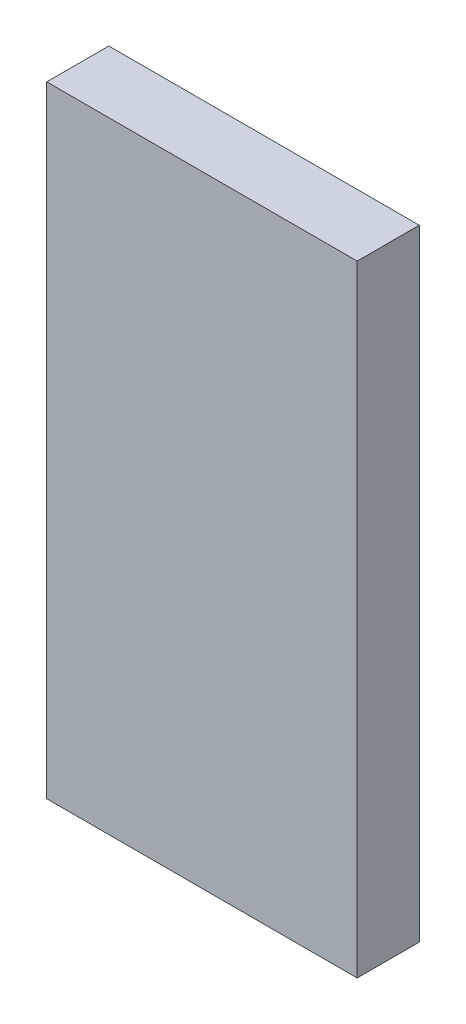
ISO-10303-21;
HEADER;
FILE_DESCRIPTION(('STEP AP214'),'2;1');
FILE_NAME('part.step','',(''),(''),'','','');
FILE_SCHEMA(('AUTOMOTIVE_DESIGN { 1 0 10303 214 1 1 1 1 }'));
ENDSEC;
DATA;
#1=APPLICATION_CONTEXT('core data for automotive mechanical design processes');
#2=APPLICATION_PROTOCOL_DEFINITION('international standard','automotive_design',2000,#1);
#3=PRODUCT_CONTEXT('',#1,'mechanical');
#4=PRODUCT('Part','Part','',(#3));
#5=PRODUCT_RELATED_PRODUCT_CATEGORY('part','',(#4));
#6=PRODUCT_DEFINITION_FORMATION('','',#4);
#7=PRODUCT_DEFINITION_CONTEXT('part definition',#1,'design');
#8=PRODUCT_DEFINITION('design','',#6,#7);
#9=PRODUCT_DEFINITION_SHAPE('','',#8);
#10=(LENGTH_UNIT() NAMED_UNIT(*) SI_UNIT(.MILLI.,.METRE.));
#11=(NAMED_UNIT(*) PLANE_ANGLE_UNIT() SI_UNIT($,.RADIAN.));
#12=(NAMED_UNIT(*) SI_UNIT($,.STERADIAN.) SOLID_ANGLE_UNIT());
#13=UNCERTAINTY_MEASURE_WITH_UNIT(LENGTH_MEASURE(1.E-05),#10,'distance_accuracy_value','');
#14=(GEOMETRIC_REPRESENTATION_CONTEXT(3) GLOBAL_UNCERTAINTY_ASSIGNED_CONTEXT((#13)) GLOBAL_UNIT_ASSIGNED_CONTEXT((#10,
#11,#12)) REPRESENTATION_CONTEXT('',''));
#15=CARTESIAN_POINT('',(0.,0.,0.));
#16=DIRECTION('',(0.,0.,1.));
#17=DIRECTION('',(1.,0.,0.));
#18=AXIS2_PLACEMENT_3D('',#15,#16,#17);
#19=CARTESIAN_POINT('',(30.,-60.,12.));
#20=DIRECTION('',(-1.,0.,0.));
#21=DIRECTION('',(0.,0.,1.));
#22=AXIS2_PLACEMENT_3D('',#19,#20,#21);
#23=PLANE('',#22);
#24=DIRECTION('',(0.,1.,0.));
#25=VECTOR('',#24,1.);
#26=CARTESIAN_POINT('',(30.,-60.,0.));
#27=LINE('',#26,#25);
#28=CARTESIAN_POINT('',(30.,-60.,0.));
#29=VERTEX_POINT('',#28);
#30=CARTESIAN_POINT('',(30.,60.,0.));
#31=VERTEX_POINT('',#30);
#32=EDGE_CURVE('E99',#29,#31,#27,.T.);
#33=ORIENTED_EDGE('',*,*,#32,.T.);
#34=DIRECTION('',(0.,0.,-1.));
#35=VECTOR('',#34,1.);
#36=CARTESIAN_POINT('',(30.,60.,12.));
#37=LINE('',#36,#35);
#38=CARTESIAN_POINT('',(30.,60.,12.));
#39=VERTEX_POINT('',#38);
#40=EDGE_CURVE('E11',#39,#31,#37,.T.);
#41=ORIENTED_EDGE('',*,*,#40,.F.);
#42=DIRECTION('',(0.,1.,0.));
#43=VECTOR('',#42,1.);
#44=CARTESIAN_POINT('',(30.,-60.,12.));
#45=LINE('',#44,#43);
#46=CARTESIAN_POINT('',(30.,-60.,12.));
#47=VERTEX_POINT('',#46);
#48=EDGE_CURVE('E87',#47,#39,#45,.T.);
#49=ORIENTED_EDGE('',*,*,#48,.F.);
#50=DIRECTION('',(0.,0.,-1.));
#51=VECTOR('',#50,1.);
#52=CARTESIAN_POINT('',(30.,-60.,12.));
#53=LINE('',#52,#51);
#54=EDGE_CURVE('E95',#47,#29,#53,.T.);
#55=ORIENTED_EDGE('',*,*,#54,.T.);
#56=EDGE_LOOP('',(#33,#41,#49,#55));
#57=FACE_BOUND('',#56,.T.);
#58=ADVANCED_FACE('F36',(#57),#23,.F.);
#59=CARTESIAN_POINT('',(-30.,60.,12.));
#60=DIRECTION('',(0.,-1.,0.));
#61=DIRECTION('',(0.,0.,-1.));
#62=AXIS2_PLACEMENT_3D('',#59,#60,#61);
#63=PLANE('',#62);
#64=DIRECTION('',(-1.,0.,0.));
#65=VECTOR('',#64,1.);
#66=CARTESIAN_POINT('',(-30.,60.,0.));
#67=LINE('',#66,#65);
#68=CARTESIAN_POINT('',(-30.,60.,0.));
#69=VERTEX_POINT('',#68);
#70=EDGE_CURVE('E91',#31,#69,#67,.T.);
#71=ORIENTED_EDGE('',*,*,#70,.T.);
#72=DIRECTION('',(0.,0.,-1.));
#73=VECTOR('',#72,1.);
#74=CARTESIAN_POINT('',(-30.,60.,12.));
#75=LINE('',#74,#73);
#76=CARTESIAN_POINT('',(-30.,60.,12.));
#77=VERTEX_POINT('',#76);
#78=EDGE_CURVE('E44',#77,#69,#75,.T.);
#79=ORIENTED_EDGE('',*,*,#78,.F.);
#80=DIRECTION('',(-1.,0.,0.));
#81=VECTOR('',#80,1.);
#82=CARTESIAN_POINT('',(-30.,60.,12.));
#83=LINE('',#82,#81);
#84=EDGE_CURVE('E82',#39,#77,#83,.T.);
#85=ORIENTED_EDGE('',*,*,#84,.F.);
#86=ORIENTED_EDGE('',*,*,#40,.T.);
#87=EDGE_LOOP('',(#71,#79,#85,#86));
#88=FACE_BOUND('',#87,.T.);
#89=ADVANCED_FACE('F90',(#88),#63,.F.);
#90=CARTESIAN_POINT('',(-30.,-60.,12.));
#91=DIRECTION('',(1.,0.,0.));
#92=DIRECTION('',(0.,0.,-1.));
#93=AXIS2_PLACEMENT_3D('',#90,#91,#92);
#94=PLANE('',#93);
#95=DIRECTION('',(0.,-1.,0.));
#96=VECTOR('',#95,1.);
#97=CARTESIAN_POINT('',(-30.,-60.,0.));
#98=LINE('',#97,#96);
#99=CARTESIAN_POINT('',(-30.,-60.,0.));
#100=VERTEX_POINT('',#99);
#101=EDGE_CURVE('E69',#69,#100,#98,.T.);
#102=ORIENTED_EDGE('',*,*,#101,.T.);
#103=DIRECTION('',(0.,0.,-1.));
#104=VECTOR('',#103,1.);
#105=CARTESIAN_POINT('',(-30.,-60.,12.));
#106=LINE('',#105,#104);
#107=CARTESIAN_POINT('',(-30.,-60.,12.));
#108=VERTEX_POINT('',#107);
#109=EDGE_CURVE('E92',#108,#100,#106,.T.);
#110=ORIENTED_EDGE('',*,*,#109,.F.);
#111=DIRECTION('',(0.,-1.,0.));
#112=VECTOR('',#111,1.);
#113=CARTESIAN_POINT('',(-30.,-60.,12.));
#114=LINE('',#113,#112);
#115=EDGE_CURVE('E85',#77,#108,#114,.T.);
#116=ORIENTED_EDGE('',*,*,#115,.F.);
#117=ORIENTED_EDGE('',*,*,#78,.T.);
#118=EDGE_LOOP('',(#102,#110,#116,#117));
#119=FACE_BOUND('',#118,.T.);
#120=ADVANCED_FACE('F93',(#119),#94,.F.);
#121=CARTESIAN_POINT('',(-30.,-60.,12.));
#122=DIRECTION('',(0.,1.,0.));
#123=DIRECTION('',(0.,0.,1.));
#124=AXIS2_PLACEMENT_3D('',#121,#122,#123);
#125=PLANE('',#124);
#126=DIRECTION('',(1.,0.,0.));
#127=VECTOR('',#126,1.);
#128=CARTESIAN_POINT('',(-30.,-60.,0.));
#129=LINE('',#128,#127);
#130=EDGE_CURVE('E75',#100,#29,#129,.T.);
#131=ORIENTED_EDGE('',*,*,#130,.T.);
#132=ORIENTED_EDGE('',*,*,#54,.F.);
#133=DIRECTION('',(1.,0.,0.));
#134=VECTOR('',#133,1.);
#135=CARTESIAN_POINT('',(-30.,-60.,12.));
#136=LINE('',#135,#134);
#137=EDGE_CURVE('E52',#108,#47,#136,.T.);
#138=ORIENTED_EDGE('',*,*,#137,.F.);
#139=ORIENTED_EDGE('',*,*,#109,.T.);
#140=EDGE_LOOP('',(#131,#132,#138,#139));
#141=FACE_BOUND('',#140,.T.);
#142=ADVANCED_FACE('F106',(#141),#125,.F.);
#143=CARTESIAN_POINT('',(0.,0.,12.));
#144=DIRECTION('',(0.,0.,-1.));
#145=DIRECTION('',(-1.,0.,0.));
#146=AXIS2_PLACEMENT_3D('',#143,#144,#145);
#147=PLANE('',#146);
#148=ORIENTED_EDGE('',*,*,#48,.T.);
#149=ORIENTED_EDGE('',*,*,#84,.T.);
#150=ORIENTED_EDGE('',*,*,#115,.T.);
#151=ORIENTED_EDGE('',*,*,#137,.T.);
#152=EDGE_LOOP('',(#148,#149,#150,#151));
#153=FACE_BOUND('',#152,.T.);
#154=ADVANCED_FACE('F83',(#153),#147,.F.);
#155=CARTESIAN_POINT('',(0.,0.,0.));
#156=DIRECTION('',(0.,0.,-1.));
#157=DIRECTION('',(-1.,0.,0.));
#158=AXIS2_PLACEMENT_3D('',#155,#156,#157);
#159=PLANE('',#158);
#160=ORIENTED_EDGE('',*,*,#32,.F.);
#161=ORIENTED_EDGE('',*,*,#130,.F.);
#162=ORIENTED_EDGE('',*,*,#101,.F.);
#163=ORIENTED_EDGE('',*,*,#70,.F.);
#164=EDGE_LOOP('',(#160,#161,#162,#163));
#165=FACE_BOUND('',#164,.T.);
#166=ADVANCED_FACE('F109',(#165),#159,.T.);
#167=CLOSED_SHELL('',(#58,#89,#120,#142,#154,#166));
#168=MANIFOLD_SOLID_BREP('B2',#167);
#169=ADVANCED_BREP_SHAPE_REPRESENTATION('',(#18,#168),#14);
#170=SHAPE_DEFINITION_REPRESENTATION(#9,#169);
ENDSEC;
END-ISO-10303-21;
